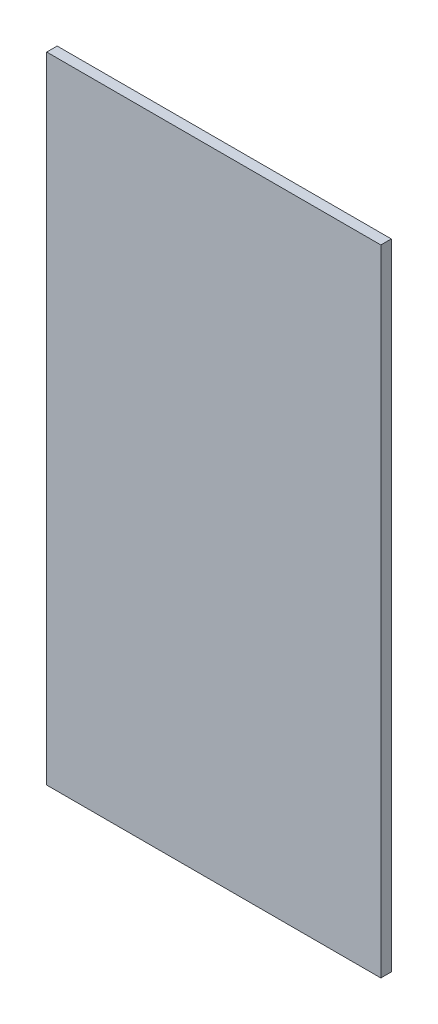
ISO-10303-21;
HEADER;
FILE_DESCRIPTION(('STEP AP214'),'2;1');
FILE_NAME('part.step','',(''),(''),'','','');
FILE_SCHEMA(('AUTOMOTIVE_DESIGN { 1 0 10303 214 1 1 1 1 }'));
ENDSEC;
DATA;
#1=APPLICATION_CONTEXT('core data for automotive mechanical design processes');
#2=APPLICATION_PROTOCOL_DEFINITION('international standard','automotive_design',2000,#1);
#3=PRODUCT_CONTEXT('',#1,'mechanical');
#4=PRODUCT('Part','Part','',(#3));
#5=PRODUCT_RELATED_PRODUCT_CATEGORY('part','',(#4));
#6=PRODUCT_DEFINITION_FORMATION('','',#4);
#7=PRODUCT_DEFINITION_CONTEXT('part definition',#1,'design');
#8=PRODUCT_DEFINITION('design','',#6,#7);
#9=PRODUCT_DEFINITION_SHAPE('','',#8);
#10=(LENGTH_UNIT() NAMED_UNIT(*) SI_UNIT(.MILLI.,.METRE.));
#11=(NAMED_UNIT(*) PLANE_ANGLE_UNIT() SI_UNIT($,.RADIAN.));
#12=(NAMED_UNIT(*) SI_UNIT($,.STERADIAN.) SOLID_ANGLE_UNIT());
#13=UNCERTAINTY_MEASURE_WITH_UNIT(LENGTH_MEASURE(1.E-05),#10,'distance_accuracy_value','');
#14=(GEOMETRIC_REPRESENTATION_CONTEXT(3) GLOBAL_UNCERTAINTY_ASSIGNED_CONTEXT((#13)) GLOBAL_UNIT_ASSIGNED_CONTEXT((#10,
#11,#12)) REPRESENTATION_CONTEXT('',''));
#15=CARTESIAN_POINT('',(0.,0.,0.));
#16=DIRECTION('',(0.,0.,1.));
#17=DIRECTION('',(1.,0.,0.));
#18=AXIS2_PLACEMENT_3D('',#15,#16,#17);
#19=CARTESIAN_POINT('',(0.,0.,1.5875));
#20=DIRECTION('',(1.,0.,0.));
#21=DIRECTION('',(0.,0.,-1.));
#22=AXIS2_PLACEMENT_3D('',#19,#20,#21);
#23=PLANE('',#22);
#24=DIRECTION('',(0.,-1.,0.));
#25=VECTOR('',#24,1.);
#26=CARTESIAN_POINT('',(0.,0.,0.));
#27=LINE('',#26,#25);
#28=CARTESIAN_POINT('',(0.,96.52,0.));
#29=VERTEX_POINT('',#28);
#30=CARTESIAN_POINT('',(0.,0.,0.));
#31=VERTEX_POINT('',#30);
#32=EDGE_CURVE('E101',#29,#31,#27,.T.);
#33=ORIENTED_EDGE('',*,*,#32,.T.);
#34=DIRECTION('',(0.,0.,-1.));
#35=VECTOR('',#34,1.);
#36=CARTESIAN_POINT('',(0.,0.,1.5875));
#37=LINE('',#36,#35);
#38=CARTESIAN_POINT('',(0.,0.,1.5875));
#39=VERTEX_POINT('',#38);
#40=EDGE_CURVE('E11',#39,#31,#37,.T.);
#41=ORIENTED_EDGE('',*,*,#40,.F.);
#42=DIRECTION('',(0.,-1.,0.));
#43=VECTOR('',#42,1.);
#44=CARTESIAN_POINT('',(0.,0.,1.5875));
#45=LINE('',#44,#43);
#46=CARTESIAN_POINT('',(0.,96.52,1.5875));
#47=VERTEX_POINT('',#46);
#48=EDGE_CURVE('E89',#47,#39,#45,.T.);
#49=ORIENTED_EDGE('',*,*,#48,.F.);
#50=DIRECTION('',(0.,0.,-1.));
#51=VECTOR('',#50,1.);
#52=CARTESIAN_POINT('',(0.,96.52,1.5875));
#53=LINE('',#52,#51);
#54=EDGE_CURVE('E97',#47,#29,#53,.T.);
#55=ORIENTED_EDGE('',*,*,#54,.T.);
#56=EDGE_LOOP('',(#33,#41,#49,#55));
#57=FACE_BOUND('',#56,.T.);
#58=ADVANCED_FACE('F38',(#57),#23,.F.);
#59=CARTESIAN_POINT('',(0.,0.,1.5875));
#60=DIRECTION('',(0.,1.,0.));
#61=DIRECTION('',(0.,0.,1.));
#62=AXIS2_PLACEMENT_3D('',#59,#60,#61);
#63=PLANE('',#62);
#64=DIRECTION('',(1.,0.,0.));
#65=VECTOR('',#64,1.);
#66=CARTESIAN_POINT('',(0.,0.,0.));
#67=LINE('',#66,#65);
#68=CARTESIAN_POINT('',(50.8,0.,0.));
#69=VERTEX_POINT('',#68);
#70=EDGE_CURVE('E93',#31,#69,#67,.T.);
#71=ORIENTED_EDGE('',*,*,#70,.T.);
#72=DIRECTION('',(0.,0.,-1.));
#73=VECTOR('',#72,1.);
#74=CARTESIAN_POINT('',(50.8,0.,1.5875));
#75=LINE('',#74,#73);
#76=CARTESIAN_POINT('',(50.8,0.,1.5875));
#77=VERTEX_POINT('',#76);
#78=EDGE_CURVE('E46',#77,#69,#75,.T.);
#79=ORIENTED_EDGE('',*,*,#78,.F.);
#80=DIRECTION('',(1.,0.,0.));
#81=VECTOR('',#80,1.);
#82=CARTESIAN_POINT('',(0.,0.,1.5875));
#83=LINE('',#82,#81);
#84=EDGE_CURVE('E84',#39,#77,#83,.T.);
#85=ORIENTED_EDGE('',*,*,#84,.F.);
#86=ORIENTED_EDGE('',*,*,#40,.T.);
#87=EDGE_LOOP('',(#71,#79,#85,#86));
#88=FACE_BOUND('',#87,.T.);
#89=ADVANCED_FACE('F92',(#88),#63,.F.);
#90=CARTESIAN_POINT('',(50.8,0.,1.5875));
#91=DIRECTION('',(-1.,0.,0.));
#92=DIRECTION('',(0.,0.,1.));
#93=AXIS2_PLACEMENT_3D('',#90,#91,#92);
#94=PLANE('',#93);
#95=DIRECTION('',(0.,1.,0.));
#96=VECTOR('',#95,1.);
#97=CARTESIAN_POINT('',(50.8,0.,0.));
#98=LINE('',#97,#96);
#99=CARTESIAN_POINT('',(50.8,96.52,0.));
#100=VERTEX_POINT('',#99);
#101=EDGE_CURVE('E71',#69,#100,#98,.T.);
#102=ORIENTED_EDGE('',*,*,#101,.T.);
#103=DIRECTION('',(0.,0.,-1.));
#104=VECTOR('',#103,1.);
#105=CARTESIAN_POINT('',(50.8,96.52,1.5875));
#106=LINE('',#105,#104);
#107=CARTESIAN_POINT('',(50.8,96.52,1.5875));
#108=VERTEX_POINT('',#107);
#109=EDGE_CURVE('E94',#108,#100,#106,.T.);
#110=ORIENTED_EDGE('',*,*,#109,.F.);
#111=DIRECTION('',(0.,1.,0.));
#112=VECTOR('',#111,1.);
#113=CARTESIAN_POINT('',(50.8,0.,1.5875));
#114=LINE('',#113,#112);
#115=EDGE_CURVE('E87',#77,#108,#114,.T.);
#116=ORIENTED_EDGE('',*,*,#115,.F.);
#117=ORIENTED_EDGE('',*,*,#78,.T.);
#118=EDGE_LOOP('',(#102,#110,#116,#117));
#119=FACE_BOUND('',#118,.T.);
#120=ADVANCED_FACE('F95',(#119),#94,.F.);
#121=CARTESIAN_POINT('',(0.,96.52,1.5875));
#122=DIRECTION('',(0.,-1.,0.));
#123=DIRECTION('',(0.,0.,-1.));
#124=AXIS2_PLACEMENT_3D('',#121,#122,#123);
#125=PLANE('',#124);
#126=DIRECTION('',(-1.,0.,0.));
#127=VECTOR('',#126,1.);
#128=CARTESIAN_POINT('',(0.,96.52,0.));
#129=LINE('',#128,#127);
#130=EDGE_CURVE('E77',#100,#29,#129,.T.);
#131=ORIENTED_EDGE('',*,*,#130,.T.);
#132=ORIENTED_EDGE('',*,*,#54,.F.);
#133=DIRECTION('',(-1.,0.,0.));
#134=VECTOR('',#133,1.);
#135=CARTESIAN_POINT('',(0.,96.52,1.5875));
#136=LINE('',#135,#134);
#137=EDGE_CURVE('E54',#108,#47,#136,.T.);
#138=ORIENTED_EDGE('',*,*,#137,.F.);
#139=ORIENTED_EDGE('',*,*,#109,.T.);
#140=EDGE_LOOP('',(#131,#132,#138,#139));
#141=FACE_BOUND('',#140,.T.);
#142=ADVANCED_FACE('F108',(#141),#125,.F.);
#143=CARTESIAN_POINT('',(0.,0.,1.5875));
#144=DIRECTION('',(0.,0.,-1.));
#145=DIRECTION('',(-1.,0.,0.));
#146=AXIS2_PLACEMENT_3D('',#143,#144,#145);
#147=PLANE('',#146);
#148=ORIENTED_EDGE('',*,*,#48,.T.);
#149=ORIENTED_EDGE('',*,*,#84,.T.);
#150=ORIENTED_EDGE('',*,*,#115,.T.);
#151=ORIENTED_EDGE('',*,*,#137,.T.);
#152=EDGE_LOOP('',(#148,#149,#150,#151));
#153=FACE_BOUND('',#152,.T.);
#154=ADVANCED_FACE('F85',(#153),#147,.F.);
#155=CARTESIAN_POINT('',(0.,0.,0.));
#156=DIRECTION('',(0.,0.,-1.));
#157=DIRECTION('',(-1.,0.,0.));
#158=AXIS2_PLACEMENT_3D('',#155,#156,#157);
#159=PLANE('',#158);
#160=ORIENTED_EDGE('',*,*,#32,.F.);
#161=ORIENTED_EDGE('',*,*,#130,.F.);
#162=ORIENTED_EDGE('',*,*,#101,.F.);
#163=ORIENTED_EDGE('',*,*,#70,.F.);
#164=EDGE_LOOP('',(#160,#161,#162,#163));
#165=FACE_BOUND('',#164,.T.);
#166=ADVANCED_FACE('F111',(#165),#159,.T.);
#167=CLOSED_SHELL('',(#58,#89,#120,#142,#154,#166));
#168=MANIFOLD_SOLID_BREP('B2',#167);
#169=ADVANCED_BREP_SHAPE_REPRESENTATION('',(#18,#168),#14);
#170=SHAPE_DEFINITION_REPRESENTATION(#9,#169);
ENDSEC;
END-ISO-10303-21;
